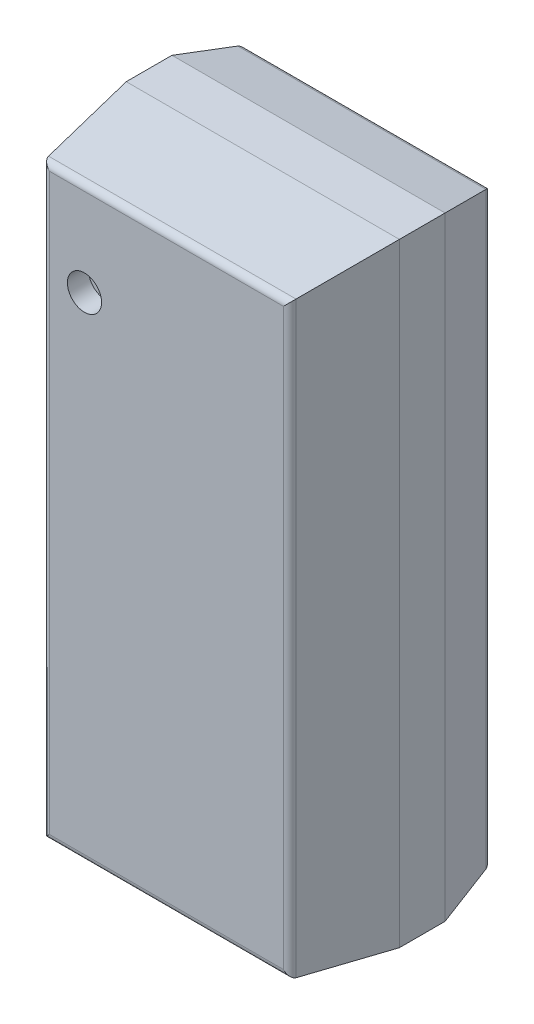
ISO-10303-21;
HEADER;
FILE_DESCRIPTION(('STEP AP214'),'2;1');
FILE_NAME('part.step','',(''),(''),'','','');
FILE_SCHEMA(('AUTOMOTIVE_DESIGN { 1 0 10303 214 1 1 1 1 }'));
ENDSEC;
DATA;
#1=APPLICATION_CONTEXT('core data for automotive mechanical design processes');
#2=APPLICATION_PROTOCOL_DEFINITION('international standard','automotive_design',2000,#1);
#3=PRODUCT_CONTEXT('',#1,'mechanical');
#4=PRODUCT('Part','Part','',(#3));
#5=PRODUCT_RELATED_PRODUCT_CATEGORY('part','',(#4));
#6=PRODUCT_DEFINITION_FORMATION('','',#4);
#7=PRODUCT_DEFINITION_CONTEXT('part definition',#1,'design');
#8=PRODUCT_DEFINITION('design','',#6,#7);
#9=PRODUCT_DEFINITION_SHAPE('','',#8);
#10=(LENGTH_UNIT() NAMED_UNIT(*) SI_UNIT(.MILLI.,.METRE.));
#11=(NAMED_UNIT(*) PLANE_ANGLE_UNIT() SI_UNIT($,.RADIAN.));
#12=(NAMED_UNIT(*) SI_UNIT($,.STERADIAN.) SOLID_ANGLE_UNIT());
#13=UNCERTAINTY_MEASURE_WITH_UNIT(LENGTH_MEASURE(1.E-05),#10,'distance_accuracy_value','');
#14=(GEOMETRIC_REPRESENTATION_CONTEXT(3) GLOBAL_UNCERTAINTY_ASSIGNED_CONTEXT((#13)) GLOBAL_UNIT_ASSIGNED_CONTEXT((#10,
#11,#12)) REPRESENTATION_CONTEXT('',''));
#15=CARTESIAN_POINT('',(0.,0.,0.));
#16=DIRECTION('',(0.,0.,1.));
#17=DIRECTION('',(1.,0.,0.));
#18=AXIS2_PLACEMENT_3D('',#15,#16,#17);
#19=CARTESIAN_POINT('',(-0.39,0.95,0.909));
#20=DIRECTION('',(0.,0.,1.));
#21=DIRECTION('',(1.,0.,0.));
#22=AXIS2_PLACEMENT_3D('',#19,#20,#21);
#23=PLANE('',#22);
#24=CARTESIAN_POINT('',(-0.39,0.95,0.909));
#25=DIRECTION('',(0.,0.,1.));
#26=DIRECTION('',(1.,0.,0.));
#27=AXIS2_PLACEMENT_3D('',#24,#25,#26);
#28=CIRCLE('',#27,0.08125);
#29=CARTESIAN_POINT('',(-0.30875,0.95,0.909));
#30=VERTEX_POINT('',#29);
#31=EDGE_CURVE('E20',#30,#30,#28,.T.);
#32=ORIENTED_EDGE('',*,*,#31,.T.);
#33=EDGE_LOOP('',(#32));
#34=FACE_BOUND('',#33,.T.);
#35=ADVANCED_FACE('F17',(#34),#23,.T.);
#36=CARTESIAN_POINT('',(-0.39,0.95,0.909));
#37=DIRECTION('',(0.,0.,1.));
#38=DIRECTION('',(1.,0.,0.));
#39=AXIS2_PLACEMENT_3D('',#36,#37,#38);
#40=CYLINDRICAL_SURFACE('',#39,0.08125);
#41=CARTESIAN_POINT('',(-0.39,0.95,1.01));
#42=DIRECTION('',(0.,0.,1.));
#43=DIRECTION('',(1.,0.,0.));
#44=AXIS2_PLACEMENT_3D('',#41,#42,#43);
#45=CIRCLE('',#44,0.08125);
#46=CARTESIAN_POINT('',(-0.30875,0.95,1.01));
#47=VERTEX_POINT('',#46);
#48=EDGE_CURVE('E100',#47,#47,#45,.F.);
#49=ORIENTED_EDGE('',*,*,#48,.F.);
#50=EDGE_LOOP('',(#49));
#51=FACE_BOUND('',#50,.T.);
#52=ORIENTED_EDGE('',*,*,#31,.F.);
#53=EDGE_LOOP('',(#52));
#54=FACE_BOUND('',#53,.T.);
#55=ADVANCED_FACE('F496',(#51,#54),#40,.F.);
#56=CARTESIAN_POINT('',(-0.65,-1.46,1.01));
#57=DIRECTION('',(0.,0.,1.));
#58=DIRECTION('',(1.,0.,0.));
#59=AXIS2_PLACEMENT_3D('',#56,#57,#58);
#60=PLANE('',#59);
#61=ORIENTED_EDGE('',*,*,#48,.T.);
#62=EDGE_LOOP('',(#61));
#63=FACE_BOUND('',#62,.T.);
#64=DIRECTION('',(0.,1.,0.));
#65=VECTOR('',#64,1.);
#66=CARTESIAN_POINT('',(0.556780644843,-1.395,1.01));
#67=LINE('',#66,#65);
#68=CARTESIAN_POINT('',(0.556780644843,1.366780644843,1.01));
#69=VERTEX_POINT('',#68);
#70=CARTESIAN_POINT('',(0.556780644843,-1.366780644843,1.01));
#71=VERTEX_POINT('',#70);
#72=EDGE_CURVE('E107',#69,#71,#67,.F.);
#73=ORIENTED_EDGE('',*,*,#72,.F.);
#74=DIRECTION('',(1.,0.,0.));
#75=VECTOR('',#74,1.);
#76=CARTESIAN_POINT('',(-0.65,1.366780644843,1.01));
#77=LINE('',#76,#75);
#78=CARTESIAN_POINT('',(-0.556780644843,1.366780644843,1.01));
#79=VERTEX_POINT('',#78);
#80=EDGE_CURVE('E96',#69,#79,#77,.F.);
#81=ORIENTED_EDGE('',*,*,#80,.T.);
#82=DIRECTION('',(0.,1.,0.));
#83=VECTOR('',#82,1.);
#84=CARTESIAN_POINT('',(-0.556780644843,-1.395,1.01));
#85=LINE('',#84,#83);
#86=CARTESIAN_POINT('',(-0.556780644843,-1.366780644843,1.01));
#87=VERTEX_POINT('',#86);
#88=EDGE_CURVE('E92',#87,#79,#85,.T.);
#89=ORIENTED_EDGE('',*,*,#88,.F.);
#90=DIRECTION('',(1.,0.,0.));
#91=VECTOR('',#90,1.);
#92=CARTESIAN_POINT('',(-0.585,-1.366780644843,1.01));
#93=LINE('',#92,#91);
#94=EDGE_CURVE('E81',#71,#87,#93,.F.);
#95=ORIENTED_EDGE('',*,*,#94,.F.);
#96=EDGE_LOOP('',(#73,#81,#89,#95));
#97=FACE_BOUND('',#96,.T.);
#98=ADVANCED_FACE('F95',(#63,#97),#60,.T.);
#99=CARTESIAN_POINT('',(-0.556780644843,-1.395,0.9775));
#100=DIRECTION('',(0.,1.,0.));
#101=DIRECTION('',(0.,0.,1.));
#102=AXIS2_PLACEMENT_3D('',#99,#100,#101);
#103=CYLINDRICAL_SURFACE('',#102,0.0325);
#104=CARTESIAN_POINT('',(-0.556780644843,1.366780644843,0.9775));
#105=DIRECTION('',(0.707106781186547,0.707106781186547,0.));
#106=DIRECTION('',(0.707106781186547,-0.707106781186547,0.));
#107=AXIS2_PLACEMENT_3D('',#104,#105,#106);
#108=ELLIPSE('',#107,0.0459619407771256,0.0325);
#109=CARTESIAN_POINT('',(-0.588959186787745,1.39895918678749,0.982059762966928));
#110=VERTEX_POINT('',#109);
#111=EDGE_CURVE('E129',#110,#79,#108,.T.);
#112=ORIENTED_EDGE('',*,*,#111,.F.);
#113=DIRECTION('',(0.,1.,0.));
#114=VECTOR('',#113,1.);
#115=CARTESIAN_POINT('',(-0.58895918678749,-1.46,0.982059762966928));
#116=LINE('',#115,#114);
#117=CARTESIAN_POINT('',(-0.588959186787745,-1.39895918678749,0.982059762966928));
#118=VERTEX_POINT('',#117);
#119=EDGE_CURVE('E104',#110,#118,#116,.F.);
#120=ORIENTED_EDGE('',*,*,#119,.T.);
#121=CARTESIAN_POINT('',(-0.556780644843,-1.366780644843,0.9775));
#122=DIRECTION('',(0.707106781186547,-0.707106781186547,0.));
#123=DIRECTION('',(0.707106781186547,0.707106781186547,0.));
#124=AXIS2_PLACEMENT_3D('',#121,#122,#123);
#125=ELLIPSE('',#124,0.0459619407771256,0.0325);
#126=EDGE_CURVE('E86',#87,#118,#125,.T.);
#127=ORIENTED_EDGE('',*,*,#126,.F.);
#128=ORIENTED_EDGE('',*,*,#88,.T.);
#129=EDGE_LOOP('',(#112,#120,#127,#128));
#130=FACE_BOUND('',#129,.T.);
#131=ADVANCED_FACE('F103',(#130),#103,.T.);
#132=CARTESIAN_POINT('',(-0.585,-1.366780644843,0.9775));
#133=DIRECTION('',(1.,0.,0.));
#134=DIRECTION('',(0.,0.,-1.));
#135=AXIS2_PLACEMENT_3D('',#132,#133,#134);
#136=CYLINDRICAL_SURFACE('',#135,0.0325);
#137=ORIENTED_EDGE('',*,*,#94,.T.);
#138=ORIENTED_EDGE('',*,*,#126,.T.);
#139=DIRECTION('',(1.,0.,0.));
#140=VECTOR('',#139,1.);
#141=CARTESIAN_POINT('',(-0.65,-1.39895918678749,0.982059762966928));
#142=LINE('',#141,#140);
#143=CARTESIAN_POINT('',(0.58895918678749,-1.39895918678774,0.982059762966928));
#144=VERTEX_POINT('',#143);
#145=EDGE_CURVE('E141',#118,#144,#142,.T.);
#146=ORIENTED_EDGE('',*,*,#145,.T.);
#147=CARTESIAN_POINT('',(0.556780644843,-1.366780644843,0.9775));
#148=DIRECTION('',(0.707106781186547,0.707106781186547,0.));
#149=DIRECTION('',(-0.707106781186547,0.707106781186547,0.));
#150=AXIS2_PLACEMENT_3D('',#147,#148,#149);
#151=ELLIPSE('',#150,0.0459619407771256,0.0325);
#152=EDGE_CURVE('E88',#71,#144,#151,.T.);
#153=ORIENTED_EDGE('',*,*,#152,.F.);
#154=EDGE_LOOP('',(#137,#138,#146,#153));
#155=FACE_BOUND('',#154,.T.);
#156=ADVANCED_FACE('F83',(#155),#136,.T.);
#157=CARTESIAN_POINT('',(0.556780644843,-1.395,0.9775));
#158=DIRECTION('',(0.,1.,0.));
#159=DIRECTION('',(0.,0.,1.));
#160=AXIS2_PLACEMENT_3D('',#157,#158,#159);
#161=CYLINDRICAL_SURFACE('',#160,0.0325);
#162=CARTESIAN_POINT('',(0.556780644843,1.366780644843,0.9775));
#163=DIRECTION('',(0.707106781186547,-0.707106781186547,0.));
#164=DIRECTION('',(0.707106781186547,0.707106781186547,0.));
#165=AXIS2_PLACEMENT_3D('',#162,#163,#164);
#166=ELLIPSE('',#165,0.0459619407771256,0.0325);
#167=CARTESIAN_POINT('',(0.588959186787745,1.39895918678749,0.982059762966928));
#168=VERTEX_POINT('',#167);
#169=EDGE_CURVE('E130',#69,#168,#166,.F.);
#170=ORIENTED_EDGE('',*,*,#169,.F.);
#171=ORIENTED_EDGE('',*,*,#72,.T.);
#172=ORIENTED_EDGE('',*,*,#152,.T.);
#173=DIRECTION('',(0.,1.,0.));
#174=VECTOR('',#173,1.);
#175=CARTESIAN_POINT('',(0.58895918678749,-1.46,0.982059762966928));
#176=LINE('',#175,#174);
#177=EDGE_CURVE('E139',#168,#144,#176,.F.);
#178=ORIENTED_EDGE('',*,*,#177,.F.);
#179=EDGE_LOOP('',(#170,#171,#172,#178));
#180=FACE_BOUND('',#179,.T.);
#181=ADVANCED_FACE('F463',(#180),#161,.T.);
#182=CARTESIAN_POINT('',(-0.585,1.366780644843,0.9775));
#183=DIRECTION('',(1.,0.,0.));
#184=DIRECTION('',(0.,0.,-1.));
#185=AXIS2_PLACEMENT_3D('',#182,#183,#184);
#186=CYLINDRICAL_SURFACE('',#185,0.0325);
#187=DIRECTION('',(1.,0.,0.));
#188=VECTOR('',#187,1.);
#189=CARTESIAN_POINT('',(-0.65,1.39895918678749,0.982059762966928));
#190=LINE('',#189,#188);
#191=EDGE_CURVE('E149',#110,#168,#190,.T.);
#192=ORIENTED_EDGE('',*,*,#191,.F.);
#193=ORIENTED_EDGE('',*,*,#111,.T.);
#194=ORIENTED_EDGE('',*,*,#80,.F.);
#195=ORIENTED_EDGE('',*,*,#169,.T.);
#196=EDGE_LOOP('',(#192,#193,#194,#195));
#197=FACE_BOUND('',#196,.T.);
#198=ADVANCED_FACE('F453',(#197),#186,.T.);
#199=CARTESIAN_POINT('',(-0.6175,-1.46,0.780645399601));
#200=DIRECTION('',(0.990108982912958,0.,-0.140300398983994));
#201=DIRECTION('',(-0.140300398983994,0.,-0.990108982912958));
#202=AXIS2_PLACEMENT_3D('',#199,#200,#201);
#203=PLANE('',#202);
#204=DIRECTION('',(0.138939605258868,-0.138939605260306,0.980505773660013));
#205=VECTOR('',#204,1.);
#206=CARTESIAN_POINT('',(-0.65,1.46000000000012,0.551290799202017));
#207=LINE('',#206,#205);
#208=CARTESIAN_POINT('',(-0.65,1.46000000000003,0.551290799202004));
#209=VERTEX_POINT('',#208);
#210=EDGE_CURVE('E155',#209,#110,#207,.T.);
#211=ORIENTED_EDGE('',*,*,#210,.F.);
#212=DIRECTION('',(0.,1.,0.));
#213=VECTOR('',#212,1.);
#214=CARTESIAN_POINT('',(-0.65,-1.46,0.551290799202));
#215=LINE('',#214,#213);
#216=CARTESIAN_POINT('',(-0.65,-1.46000000000003,0.551290799202004));
#217=VERTEX_POINT('',#216);
#218=EDGE_CURVE('E183',#209,#217,#215,.F.);
#219=ORIENTED_EDGE('',*,*,#218,.T.);
#220=DIRECTION('',(0.138939605258868,0.138939605260306,0.980505773660013));
#221=VECTOR('',#220,1.);
#222=CARTESIAN_POINT('',(-0.65,-1.46000000000012,0.551290799202017));
#223=LINE('',#222,#221);
#224=EDGE_CURVE('E142',#217,#118,#223,.T.);
#225=ORIENTED_EDGE('',*,*,#224,.T.);
#226=ORIENTED_EDGE('',*,*,#119,.F.);
#227=EDGE_LOOP('',(#211,#219,#225,#226));
#228=FACE_BOUND('',#227,.T.);
#229=ADVANCED_FACE('F444',(#228),#203,.F.);
#230=CARTESIAN_POINT('',(-0.65,-1.4275,0.780645399601));
#231=DIRECTION('',(0.,0.990108982912958,-0.140300398983994));
#232=DIRECTION('',(0.,0.140300398983994,0.990108982912958));
#233=AXIS2_PLACEMENT_3D('',#230,#231,#232);
#234=PLANE('',#233);
#235=DIRECTION('',(1.,0.,0.));
#236=VECTOR('',#235,1.);
#237=CARTESIAN_POINT('',(-0.65,-1.46,0.551290799202));
#238=LINE('',#237,#236);
#239=CARTESIAN_POINT('',(0.650000000000031,-1.46,0.551290799202004));
#240=VERTEX_POINT('',#239);
#241=EDGE_CURVE('E170',#217,#240,#238,.T.);
#242=ORIENTED_EDGE('',*,*,#241,.T.);
#243=DIRECTION('',(0.138939605260306,-0.138939605258868,-0.980505773660013));
#244=VECTOR('',#243,1.);
#245=CARTESIAN_POINT('',(0.58895918678749,-1.398959186788,0.982059762966928));
#246=LINE('',#245,#244);
#247=EDGE_CURVE('E144',#144,#240,#246,.T.);
#248=ORIENTED_EDGE('',*,*,#247,.F.);
#249=ORIENTED_EDGE('',*,*,#145,.F.);
#250=ORIENTED_EDGE('',*,*,#224,.F.);
#251=EDGE_LOOP('',(#242,#248,#249,#250));
#252=FACE_BOUND('',#251,.T.);
#253=ADVANCED_FACE('F435',(#252),#234,.F.);
#254=CARTESIAN_POINT('',(0.6175,-1.46,0.780645399601));
#255=DIRECTION('',(0.990108982912958,0.,0.140300398983994));
#256=DIRECTION('',(0.140300398983994,0.,-0.990108982912958));
#257=AXIS2_PLACEMENT_3D('',#254,#255,#256);
#258=PLANE('',#257);
#259=DIRECTION('',(0.138939605258869,0.138939605260306,-0.980505773660013));
#260=VECTOR('',#259,1.);
#261=CARTESIAN_POINT('',(0.588959186788,1.39895918678749,0.982059762966928));
#262=LINE('',#261,#260);
#263=CARTESIAN_POINT('',(0.65,1.46000000000003,0.551290799202004));
#264=VERTEX_POINT('',#263);
#265=EDGE_CURVE('E150',#168,#264,#262,.T.);
#266=ORIENTED_EDGE('',*,*,#265,.F.);
#267=ORIENTED_EDGE('',*,*,#177,.T.);
#268=ORIENTED_EDGE('',*,*,#247,.T.);
#269=DIRECTION('',(0.,1.,0.));
#270=VECTOR('',#269,1.);
#271=CARTESIAN_POINT('',(0.65,-1.46,0.551290799202));
#272=LINE('',#271,#270);
#273=EDGE_CURVE('E180',#264,#240,#272,.F.);
#274=ORIENTED_EDGE('',*,*,#273,.F.);
#275=EDGE_LOOP('',(#266,#267,#268,#274));
#276=FACE_BOUND('',#275,.T.);
#277=ADVANCED_FACE('F426',(#276),#258,.T.);
#278=CARTESIAN_POINT('',(-0.65,1.4275,0.780645399601));
#279=DIRECTION('',(0.,0.990108982912958,0.140300398983994));
#280=DIRECTION('',(0.,-0.140300398983994,0.990108982912958));
#281=AXIS2_PLACEMENT_3D('',#278,#279,#280);
#282=PLANE('',#281);
#283=DIRECTION('',(1.,0.,0.));
#284=VECTOR('',#283,1.);
#285=CARTESIAN_POINT('',(-0.65,1.46,0.551290799202));
#286=LINE('',#285,#284);
#287=EDGE_CURVE('E202',#209,#264,#286,.T.);
#288=ORIENTED_EDGE('',*,*,#287,.F.);
#289=ORIENTED_EDGE('',*,*,#210,.T.);
#290=ORIENTED_EDGE('',*,*,#191,.T.);
#291=ORIENTED_EDGE('',*,*,#265,.T.);
#292=EDGE_LOOP('',(#288,#289,#290,#291));
#293=FACE_BOUND('',#292,.T.);
#294=ADVANCED_FACE('F417',(#293),#282,.T.);
#295=CARTESIAN_POINT('',(-0.65,-1.46,0.055));
#296=DIRECTION('',(1.,0.,0.));
#297=DIRECTION('',(0.,0.,-1.));
#298=AXIS2_PLACEMENT_3D('',#295,#296,#297);
#299=PLANE('',#298);
#300=DIRECTION('',(0.,0.,1.));
#301=VECTOR('',#300,1.);
#302=CARTESIAN_POINT('',(-0.65,1.46,0.055));
#303=LINE('',#302,#301);
#304=CARTESIAN_POINT('',(-0.649999999999977,1.45999999999993,0.333790799202016));
#305=VERTEX_POINT('',#304);
#306=EDGE_CURVE('E206',#305,#209,#303,.T.);
#307=ORIENTED_EDGE('',*,*,#306,.F.);
#308=DIRECTION('',(0.,1.,0.));
#309=VECTOR('',#308,1.);
#310=CARTESIAN_POINT('',(-0.649999999999909,-1.46,0.333790799202021));
#311=LINE('',#310,#309);
#312=CARTESIAN_POINT('',(-0.649999999999977,-1.45999999999995,0.333790799202016));
#313=VERTEX_POINT('',#312);
#314=EDGE_CURVE('E205',#313,#305,#311,.T.);
#315=ORIENTED_EDGE('',*,*,#314,.F.);
#316=DIRECTION('',(0.,0.,1.));
#317=VECTOR('',#316,1.);
#318=CARTESIAN_POINT('',(-0.65,-1.46,0.055));
#319=LINE('',#318,#317);
#320=EDGE_CURVE('E173',#313,#217,#319,.T.);
#321=ORIENTED_EDGE('',*,*,#320,.T.);
#322=ORIENTED_EDGE('',*,*,#218,.F.);
#323=EDGE_LOOP('',(#307,#315,#321,#322));
#324=FACE_BOUND('',#323,.T.);
#325=ADVANCED_FACE('F407',(#324),#299,.F.);
#326=CARTESIAN_POINT('',(-0.65,-1.46,0.055));
#327=DIRECTION('',(0.,1.,0.));
#328=DIRECTION('',(0.,0.,1.));
#329=AXIS2_PLACEMENT_3D('',#326,#327,#328);
#330=PLANE('',#329);
#331=ORIENTED_EDGE('',*,*,#320,.F.);
#332=DIRECTION('',(1.,0.,0.));
#333=VECTOR('',#332,1.);
#334=CARTESIAN_POINT('',(-0.65,-1.45999999999991,0.333790799202021));
#335=LINE('',#334,#333);
#336=CARTESIAN_POINT('',(0.649999999999955,-1.45999999999998,0.333790799202021));
#337=VERTEX_POINT('',#336);
#338=EDGE_CURVE('E235',#337,#313,#335,.F.);
#339=ORIENTED_EDGE('',*,*,#338,.F.);
#340=DIRECTION('',(0.,0.,-1.));
#341=VECTOR('',#340,1.);
#342=CARTESIAN_POINT('',(0.65,-1.46,0.055));
#343=LINE('',#342,#341);
#344=EDGE_CURVE('E172',#240,#337,#343,.T.);
#345=ORIENTED_EDGE('',*,*,#344,.F.);
#346=ORIENTED_EDGE('',*,*,#241,.F.);
#347=EDGE_LOOP('',(#331,#339,#345,#346));
#348=FACE_BOUND('',#347,.T.);
#349=ADVANCED_FACE('F398',(#348),#330,.F.);
#350=CARTESIAN_POINT('',(0.65,-1.46,0.055));
#351=DIRECTION('',(1.,0.,0.));
#352=DIRECTION('',(0.,0.,-1.));
#353=AXIS2_PLACEMENT_3D('',#350,#351,#352);
#354=PLANE('',#353);
#355=DIRECTION('',(0.,0.,1.));
#356=VECTOR('',#355,1.);
#357=CARTESIAN_POINT('',(0.65,1.46,0.055));
#358=LINE('',#357,#356);
#359=CARTESIAN_POINT('',(0.649999999999978,1.45999999999995,0.333790799202021));
#360=VERTEX_POINT('',#359);
#361=EDGE_CURVE('E210',#264,#360,#358,.F.);
#362=ORIENTED_EDGE('',*,*,#361,.F.);
#363=ORIENTED_EDGE('',*,*,#273,.T.);
#364=ORIENTED_EDGE('',*,*,#344,.T.);
#365=DIRECTION('',(0.,1.,0.));
#366=VECTOR('',#365,1.);
#367=CARTESIAN_POINT('',(0.649999999999909,-1.46,0.333790799202021));
#368=LINE('',#367,#366);
#369=EDGE_CURVE('E228',#337,#360,#368,.T.);
#370=ORIENTED_EDGE('',*,*,#369,.T.);
#371=EDGE_LOOP('',(#362,#363,#364,#370));
#372=FACE_BOUND('',#371,.T.);
#373=ADVANCED_FACE('F389',(#372),#354,.T.);
#374=CARTESIAN_POINT('',(-0.65,1.46,0.055));
#375=DIRECTION('',(0.,1.,0.));
#376=DIRECTION('',(0.,0.,1.));
#377=AXIS2_PLACEMENT_3D('',#374,#375,#376);
#378=PLANE('',#377);
#379=ORIENTED_EDGE('',*,*,#306,.T.);
#380=ORIENTED_EDGE('',*,*,#287,.T.);
#381=ORIENTED_EDGE('',*,*,#361,.T.);
#382=DIRECTION('',(1.,0.,0.));
#383=VECTOR('',#382,1.);
#384=CARTESIAN_POINT('',(-0.65,1.45999999999991,0.333790799202021));
#385=LINE('',#384,#383);
#386=EDGE_CURVE('E254',#360,#305,#385,.F.);
#387=ORIENTED_EDGE('',*,*,#386,.T.);
#388=EDGE_LOOP('',(#379,#380,#381,#387));
#389=FACE_BOUND('',#388,.T.);
#390=ADVANCED_FACE('F380',(#389),#378,.T.);
#391=CARTESIAN_POINT('',(-0.6175,-1.46,0.194395399601));
#392=DIRECTION('',(-0.973880762212996,0.,-0.227060038296999));
#393=DIRECTION('',(-0.227060038296999,0.,0.973880762212996));
#394=AXIS2_PLACEMENT_3D('',#391,#392,#393);
#395=PLANE('',#394);
#396=DIRECTION('',(0.221423876629437,-0.221423876627519,-0.949706761962677));
#397=VECTOR('',#396,1.);
#398=CARTESIAN_POINT('',(-0.65,1.45999999999991,0.333790799202021));
#399=LINE('',#398,#397);
#400=CARTESIAN_POINT('',(-0.590856849198944,1.40085684919918,0.0801205487553268));
#401=VERTEX_POINT('',#400);
#402=EDGE_CURVE('E256',#305,#401,#399,.T.);
#403=ORIENTED_EDGE('',*,*,#402,.T.);
#404=DIRECTION('',(0.,1.,0.));
#405=VECTOR('',#404,1.);
#406=CARTESIAN_POINT('',(-0.590856849198923,-1.395,0.080120548755348));
#407=LINE('',#406,#405);
#408=CARTESIAN_POINT('',(-0.590856849198944,-1.40085684919918,0.0801205487553268));
#409=VERTEX_POINT('',#408);
#410=EDGE_CURVE('E128',#409,#401,#407,.T.);
#411=ORIENTED_EDGE('',*,*,#410,.F.);
#412=DIRECTION('',(0.221423876629437,0.221423876627519,-0.949706761962677));
#413=VECTOR('',#412,1.);
#414=CARTESIAN_POINT('',(-0.65,-1.45999999999991,0.333790799202021));
#415=LINE('',#414,#413);
#416=EDGE_CURVE('E237',#313,#409,#415,.T.);
#417=ORIENTED_EDGE('',*,*,#416,.F.);
#418=ORIENTED_EDGE('',*,*,#314,.T.);
#419=EDGE_LOOP('',(#403,#411,#417,#418));
#420=FACE_BOUND('',#419,.T.);
#421=ADVANCED_FACE('F301',(#420),#395,.T.);
#422=CARTESIAN_POINT('',(-0.65,-1.4275,0.194395399601));
#423=DIRECTION('',(0.,-0.973880762212996,-0.227060038296999));
#424=DIRECTION('',(0.,0.227060038296999,-0.973880762212996));
#425=AXIS2_PLACEMENT_3D('',#422,#423,#424);
#426=PLANE('',#425);
#427=ORIENTED_EDGE('',*,*,#338,.T.);
#428=ORIENTED_EDGE('',*,*,#416,.T.);
#429=DIRECTION('',(1.,0.,0.));
#430=VECTOR('',#429,1.);
#431=CARTESIAN_POINT('',(-0.585,-1.40085684919892,0.0801205487553481));
#432=LINE('',#431,#430);
#433=CARTESIAN_POINT('',(0.590856849199179,-1.40085684919894,0.0801205487553269));
#434=VERTEX_POINT('',#433);
#435=EDGE_CURVE('E127',#434,#409,#432,.F.);
#436=ORIENTED_EDGE('',*,*,#435,.F.);
#437=DIRECTION('',(0.221423876627519,-0.221423876629435,0.949706761962678));
#438=VECTOR('',#437,1.);
#439=CARTESIAN_POINT('',(0.590856849199421,-1.400856849199,0.0801205487552319));
#440=LINE('',#439,#438);
#441=EDGE_CURVE('E231',#434,#337,#440,.T.);
#442=ORIENTED_EDGE('',*,*,#441,.T.);
#443=EDGE_LOOP('',(#427,#428,#436,#442));
#444=FACE_BOUND('',#443,.T.);
#445=ADVANCED_FACE('F275',(#444),#426,.T.);
#446=CARTESIAN_POINT('',(0.6175,-1.46,0.194395399601));
#447=DIRECTION('',(-0.973880762212996,0.,0.227060038296999));
#448=DIRECTION('',(0.227060038296999,0.,0.973880762212996));
#449=AXIS2_PLACEMENT_3D('',#446,#447,#448);
#450=PLANE('',#449);
#451=DIRECTION('',(0.221423876629437,0.221423876627519,0.949706761962677));
#452=VECTOR('',#451,1.);
#453=CARTESIAN_POINT('',(0.590856849199,1.40085684919942,0.080120548755232));
#454=LINE('',#453,#452);
#455=CARTESIAN_POINT('',(0.590856849198944,1.40085684919918,0.0801205487553268));
#456=VERTEX_POINT('',#455);
#457=EDGE_CURVE('E230',#456,#360,#454,.T.);
#458=ORIENTED_EDGE('',*,*,#457,.T.);
#459=ORIENTED_EDGE('',*,*,#369,.F.);
#460=ORIENTED_EDGE('',*,*,#441,.F.);
#461=DIRECTION('',(0.,1.,0.));
#462=VECTOR('',#461,1.);
#463=CARTESIAN_POINT('',(0.590856849198923,-1.395,0.080120548755348));
#464=LINE('',#463,#462);
#465=EDGE_CURVE('E124',#456,#434,#464,.F.);
#466=ORIENTED_EDGE('',*,*,#465,.F.);
#467=EDGE_LOOP('',(#458,#459,#460,#466));
#468=FACE_BOUND('',#467,.T.);
#469=ADVANCED_FACE('F280',(#468),#450,.F.);
#470=CARTESIAN_POINT('',(-0.65,1.4275,0.194395399601));
#471=DIRECTION('',(0.,-0.973880762212996,0.227060038296999));
#472=DIRECTION('',(0.,-0.227060038296999,-0.973880762212996));
#473=AXIS2_PLACEMENT_3D('',#470,#471,#472);
#474=PLANE('',#473);
#475=ORIENTED_EDGE('',*,*,#386,.F.);
#476=ORIENTED_EDGE('',*,*,#457,.F.);
#477=DIRECTION('',(1.,0.,0.));
#478=VECTOR('',#477,1.);
#479=CARTESIAN_POINT('',(-0.585,1.40085684919892,0.0801205487553481));
#480=LINE('',#479,#478);
#481=EDGE_CURVE('E118',#401,#456,#480,.T.);
#482=ORIENTED_EDGE('',*,*,#481,.F.);
#483=ORIENTED_EDGE('',*,*,#402,.F.);
#484=EDGE_LOOP('',(#475,#476,#482,#483));
#485=FACE_BOUND('',#484,.T.);
#486=ADVANCED_FACE('F303',(#485),#474,.F.);
#487=CARTESIAN_POINT('',(-0.559205724427,-1.395,0.0875));
#488=DIRECTION('',(0.,1.,0.));
#489=DIRECTION('',(0.,0.,1.));
#490=AXIS2_PLACEMENT_3D('',#487,#488,#489);
#491=CYLINDRICAL_SURFACE('',#490,0.0325);
#492=DIRECTION('',(0.,1.,0.));
#493=VECTOR('',#492,1.);
#494=CARTESIAN_POINT('',(-0.559205724427,-1.46,0.055));
#495=LINE('',#494,#493);
#496=CARTESIAN_POINT('',(-0.559205724427,1.369205724427,0.055));
#497=VERTEX_POINT('',#496);
#498=CARTESIAN_POINT('',(-0.559205724427,-1.369205724427,0.055));
#499=VERTEX_POINT('',#498);
#500=EDGE_CURVE('E117',#497,#499,#495,.F.);
#501=ORIENTED_EDGE('',*,*,#500,.T.);
#502=CARTESIAN_POINT('',(-0.559205724427,-1.369205724427,0.0875));
#503=DIRECTION('',(0.707106781186547,-0.707106781186547,0.));
#504=DIRECTION('',(0.707106781186547,0.707106781186547,0.));
#505=AXIS2_PLACEMENT_3D('',#502,#503,#504);
#506=ELLIPSE('',#505,0.0459619407771256,0.0325);
#507=EDGE_CURVE('E125',#409,#499,#506,.T.);
#508=ORIENTED_EDGE('',*,*,#507,.F.);
#509=ORIENTED_EDGE('',*,*,#410,.T.);
#510=CARTESIAN_POINT('',(-0.559205724427,1.369205724427,0.0875));
#511=DIRECTION('',(0.707106781186547,0.707106781186547,0.));
#512=DIRECTION('',(0.707106781186547,-0.707106781186547,0.));
#513=AXIS2_PLACEMENT_3D('',#510,#511,#512);
#514=ELLIPSE('',#513,0.0459619407771256,0.0325);
#515=EDGE_CURVE('E119',#497,#401,#514,.T.);
#516=ORIENTED_EDGE('',*,*,#515,.F.);
#517=EDGE_LOOP('',(#501,#508,#509,#516));
#518=FACE_BOUND('',#517,.T.);
#519=ADVANCED_FACE('F297',(#518),#491,.T.);
#520=CARTESIAN_POINT('',(-0.585,-1.369205724427,0.0875));
#521=DIRECTION('',(1.,0.,0.));
#522=DIRECTION('',(0.,0.,-1.));
#523=AXIS2_PLACEMENT_3D('',#520,#521,#522);
#524=CYLINDRICAL_SURFACE('',#523,0.0325);
#525=CARTESIAN_POINT('',(0.559205724427,-1.369205724427,0.0875));
#526=DIRECTION('',(0.707106781186547,0.707106781186547,0.));
#527=DIRECTION('',(-0.707106781186547,0.707106781186547,0.));
#528=AXIS2_PLACEMENT_3D('',#525,#526,#527);
#529=ELLIPSE('',#528,0.0459619407771256,0.0325);
#530=CARTESIAN_POINT('',(0.559205724427,-1.369205724427,0.055));
#531=VERTEX_POINT('',#530);
#532=EDGE_CURVE('E122',#434,#531,#529,.T.);
#533=ORIENTED_EDGE('',*,*,#532,.F.);
#534=ORIENTED_EDGE('',*,*,#435,.T.);
#535=ORIENTED_EDGE('',*,*,#507,.T.);
#536=DIRECTION('',(1.,0.,0.));
#537=VECTOR('',#536,1.);
#538=CARTESIAN_POINT('',(-0.65,-1.369205724427,0.055));
#539=LINE('',#538,#537);
#540=EDGE_CURVE('E289',#499,#531,#539,.T.);
#541=ORIENTED_EDGE('',*,*,#540,.T.);
#542=EDGE_LOOP('',(#533,#534,#535,#541));
#543=FACE_BOUND('',#542,.T.);
#544=ADVANCED_FACE('F310',(#543),#524,.T.);
#545=CARTESIAN_POINT('',(0.559205724427,-1.395,0.0875));
#546=DIRECTION('',(0.,1.,0.));
#547=DIRECTION('',(0.,0.,1.));
#548=AXIS2_PLACEMENT_3D('',#545,#546,#547);
#549=CYLINDRICAL_SURFACE('',#548,0.0325);
#550=ORIENTED_EDGE('',*,*,#465,.T.);
#551=ORIENTED_EDGE('',*,*,#532,.T.);
#552=DIRECTION('',(0.,1.,0.));
#553=VECTOR('',#552,1.);
#554=CARTESIAN_POINT('',(0.559205724427,-1.46,0.055));
#555=LINE('',#554,#553);
#556=CARTESIAN_POINT('',(0.559205724427,1.369205724427,0.055));
#557=VERTEX_POINT('',#556);
#558=EDGE_CURVE('E26',#531,#557,#555,.T.);
#559=ORIENTED_EDGE('',*,*,#558,.T.);
#560=CARTESIAN_POINT('',(0.559205724427,1.369205724427,0.0875));
#561=DIRECTION('',(0.707106781186547,-0.707106781186547,0.));
#562=DIRECTION('',(0.707106781186547,0.707106781186547,0.));
#563=AXIS2_PLACEMENT_3D('',#560,#561,#562);
#564=ELLIPSE('',#563,0.0459619407771256,0.0325);
#565=EDGE_CURVE('E34',#456,#557,#564,.F.);
#566=ORIENTED_EDGE('',*,*,#565,.F.);
#567=EDGE_LOOP('',(#550,#551,#559,#566));
#568=FACE_BOUND('',#567,.T.);
#569=ADVANCED_FACE('F282',(#568),#549,.T.);
#570=CARTESIAN_POINT('',(-0.585,1.369205724427,0.0875));
#571=DIRECTION('',(1.,0.,0.));
#572=DIRECTION('',(0.,0.,-1.));
#573=AXIS2_PLACEMENT_3D('',#570,#571,#572);
#574=CYLINDRICAL_SURFACE('',#573,0.0325);
#575=ORIENTED_EDGE('',*,*,#565,.T.);
#576=DIRECTION('',(1.,0.,0.));
#577=VECTOR('',#576,1.);
#578=CARTESIAN_POINT('',(-0.65,1.369205724427,0.055));
#579=LINE('',#578,#577);
#580=EDGE_CURVE('E11',#557,#497,#579,.F.);
#581=ORIENTED_EDGE('',*,*,#580,.T.);
#582=ORIENTED_EDGE('',*,*,#515,.T.);
#583=ORIENTED_EDGE('',*,*,#481,.T.);
#584=EDGE_LOOP('',(#575,#581,#582,#583));
#585=FACE_BOUND('',#584,.T.);
#586=ADVANCED_FACE('F298',(#585),#574,.T.);
#587=CARTESIAN_POINT('',(-0.65,-1.46,0.055));
#588=DIRECTION('',(0.,0.,1.));
#589=DIRECTION('',(1.,0.,0.));
#590=AXIS2_PLACEMENT_3D('',#587,#588,#589);
#591=PLANE('',#590);
#592=ORIENTED_EDGE('',*,*,#558,.F.);
#593=ORIENTED_EDGE('',*,*,#540,.F.);
#594=ORIENTED_EDGE('',*,*,#500,.F.);
#595=ORIENTED_EDGE('',*,*,#580,.F.);
#596=EDGE_LOOP('',(#592,#593,#594,#595));
#597=FACE_BOUND('',#596,.T.);
#598=ADVANCED_FACE('F308',(#597),#591,.F.);
#599=CLOSED_SHELL('',(#35,#55,#98,#131,#156,#181,#198,#229,#253,#277,#294,#325,#349,#373,#390,
#421,#445,#469,#486,#519,#544,#569,#586,#598));
#600=MANIFOLD_SOLID_BREP('B1',#599);
#601=ADVANCED_BREP_SHAPE_REPRESENTATION('',(#18,#600),#14);
#602=SHAPE_DEFINITION_REPRESENTATION(#9,#601);
ENDSEC;
END-ISO-10303-21;
